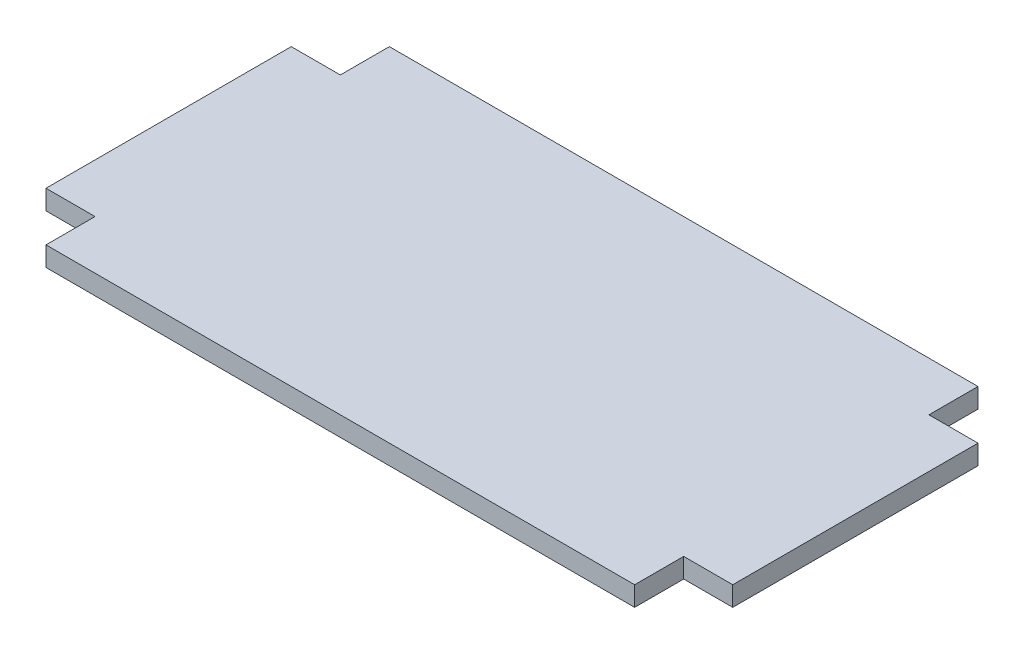
ISO-10303-21;
HEADER;
FILE_DESCRIPTION(('STEP AP214'),'2;1');
FILE_NAME('part.step','',(''),(''),'','','');
FILE_SCHEMA(('AUTOMOTIVE_DESIGN { 1 0 10303 214 1 1 1 1 }'));
ENDSEC;
DATA;
#1=APPLICATION_CONTEXT('core data for automotive mechanical design processes');
#2=APPLICATION_PROTOCOL_DEFINITION('international standard','automotive_design',2000,#1);
#3=PRODUCT_CONTEXT('',#1,'mechanical');
#4=PRODUCT('Part','Part','',(#3));
#5=PRODUCT_RELATED_PRODUCT_CATEGORY('part','',(#4));
#6=PRODUCT_DEFINITION_FORMATION('','',#4);
#7=PRODUCT_DEFINITION_CONTEXT('part definition',#1,'design');
#8=PRODUCT_DEFINITION('design','',#6,#7);
#9=PRODUCT_DEFINITION_SHAPE('','',#8);
#10=(LENGTH_UNIT() NAMED_UNIT(*) SI_UNIT(.MILLI.,.METRE.));
#11=(NAMED_UNIT(*) PLANE_ANGLE_UNIT() SI_UNIT($,.RADIAN.));
#12=(NAMED_UNIT(*) SI_UNIT($,.STERADIAN.) SOLID_ANGLE_UNIT());
#13=UNCERTAINTY_MEASURE_WITH_UNIT(LENGTH_MEASURE(1.E-05),#10,'distance_accuracy_value','');
#14=(GEOMETRIC_REPRESENTATION_CONTEXT(3) GLOBAL_UNCERTAINTY_ASSIGNED_CONTEXT((#13)) GLOBAL_UNIT_ASSIGNED_CONTEXT((#10,
#11,#12)) REPRESENTATION_CONTEXT('',''));
#15=CARTESIAN_POINT('',(0.,0.,0.));
#16=DIRECTION('',(0.,0.,1.));
#17=DIRECTION('',(1.,0.,0.));
#18=AXIS2_PLACEMENT_3D('',#15,#16,#17);
#19=CARTESIAN_POINT('',(60.,4.,35.));
#20=DIRECTION('',(-1.,0.,0.));
#21=DIRECTION('',(0.,0.,1.));
#22=AXIS2_PLACEMENT_3D('',#19,#20,#21);
#23=PLANE('',#22);
#24=DIRECTION('',(0.,0.,-1.));
#25=VECTOR('',#24,1.);
#26=CARTESIAN_POINT('',(60.,0.,35.));
#27=LINE('',#26,#25);
#28=CARTESIAN_POINT('',(60.,0.,35.));
#29=VERTEX_POINT('',#28);
#30=CARTESIAN_POINT('',(60.,0.,25.));
#31=VERTEX_POINT('',#30);
#32=EDGE_CURVE('E170',#29,#31,#27,.T.);
#33=ORIENTED_EDGE('',*,*,#32,.T.);
#34=DIRECTION('',(0.,-1.,0.));
#35=VECTOR('',#34,1.);
#36=CARTESIAN_POINT('',(60.,4.,25.));
#37=LINE('',#36,#35);
#38=CARTESIAN_POINT('',(60.,4.,25.));
#39=VERTEX_POINT('',#38);
#40=EDGE_CURVE('E11',#39,#31,#37,.T.);
#41=ORIENTED_EDGE('',*,*,#40,.F.);
#42=DIRECTION('',(0.,0.,-1.));
#43=VECTOR('',#42,1.);
#44=CARTESIAN_POINT('',(60.,4.,35.));
#45=LINE('',#44,#43);
#46=CARTESIAN_POINT('',(60.,4.,35.));
#47=VERTEX_POINT('',#46);
#48=EDGE_CURVE('E204',#47,#39,#45,.T.);
#49=ORIENTED_EDGE('',*,*,#48,.F.);
#50=DIRECTION('',(0.,-1.,0.));
#51=VECTOR('',#50,1.);
#52=CARTESIAN_POINT('',(60.,4.,35.));
#53=LINE('',#52,#51);
#54=EDGE_CURVE('E166',#47,#29,#53,.T.);
#55=ORIENTED_EDGE('',*,*,#54,.T.);
#56=EDGE_LOOP('',(#33,#41,#49,#55));
#57=FACE_BOUND('',#56,.T.);
#58=ADVANCED_FACE('F45',(#57),#23,.F.);
#59=CARTESIAN_POINT('',(70.,4.,25.));
#60=DIRECTION('',(0.,0.,-1.));
#61=DIRECTION('',(-1.,0.,0.));
#62=AXIS2_PLACEMENT_3D('',#59,#60,#61);
#63=PLANE('',#62);
#64=DIRECTION('',(1.,0.,0.));
#65=VECTOR('',#64,1.);
#66=CARTESIAN_POINT('',(70.,0.,25.));
#67=LINE('',#66,#65);
#68=CARTESIAN_POINT('',(70.,0.,25.));
#69=VERTEX_POINT('',#68);
#70=EDGE_CURVE('E174',#31,#69,#67,.T.);
#71=ORIENTED_EDGE('',*,*,#70,.T.);
#72=DIRECTION('',(0.,-1.,0.));
#73=VECTOR('',#72,1.);
#74=CARTESIAN_POINT('',(70.,4.,25.));
#75=LINE('',#74,#73);
#76=CARTESIAN_POINT('',(70.,4.,25.));
#77=VERTEX_POINT('',#76);
#78=EDGE_CURVE('E54',#77,#69,#75,.T.);
#79=ORIENTED_EDGE('',*,*,#78,.F.);
#80=DIRECTION('',(1.,0.,0.));
#81=VECTOR('',#80,1.);
#82=CARTESIAN_POINT('',(70.,4.,25.));
#83=LINE('',#82,#81);
#84=EDGE_CURVE('E117',#39,#77,#83,.T.);
#85=ORIENTED_EDGE('',*,*,#84,.F.);
#86=ORIENTED_EDGE('',*,*,#40,.T.);
#87=EDGE_LOOP('',(#71,#79,#85,#86));
#88=FACE_BOUND('',#87,.T.);
#89=ADVANCED_FACE('F298',(#88),#63,.F.);
#90=CARTESIAN_POINT('',(70.,4.,25.));
#91=DIRECTION('',(-1.,0.,0.));
#92=DIRECTION('',(0.,0.,1.));
#93=AXIS2_PLACEMENT_3D('',#90,#91,#92);
#94=PLANE('',#93);
#95=DIRECTION('',(0.,0.,-1.));
#96=VECTOR('',#95,1.);
#97=CARTESIAN_POINT('',(70.,0.,25.));
#98=LINE('',#97,#96);
#99=CARTESIAN_POINT('',(70.,0.,-25.));
#100=VERTEX_POINT('',#99);
#101=EDGE_CURVE('E177',#69,#100,#98,.T.);
#102=ORIENTED_EDGE('',*,*,#101,.T.);
#103=DIRECTION('',(0.,-1.,0.));
#104=VECTOR('',#103,1.);
#105=CARTESIAN_POINT('',(70.,4.,-25.));
#106=LINE('',#105,#104);
#107=CARTESIAN_POINT('',(70.,4.,-25.));
#108=VERTEX_POINT('',#107);
#109=EDGE_CURVE('E231',#108,#100,#106,.T.);
#110=ORIENTED_EDGE('',*,*,#109,.F.);
#111=DIRECTION('',(0.,0.,-1.));
#112=VECTOR('',#111,1.);
#113=CARTESIAN_POINT('',(70.,4.,25.));
#114=LINE('',#113,#112);
#115=EDGE_CURVE('E241',#77,#108,#114,.T.);
#116=ORIENTED_EDGE('',*,*,#115,.F.);
#117=ORIENTED_EDGE('',*,*,#78,.T.);
#118=EDGE_LOOP('',(#102,#110,#116,#117));
#119=FACE_BOUND('',#118,.T.);
#120=ADVANCED_FACE('F239',(#119),#94,.F.);
#121=CARTESIAN_POINT('',(70.,4.,-25.));
#122=DIRECTION('',(0.,0.,1.));
#123=DIRECTION('',(1.,0.,0.));
#124=AXIS2_PLACEMENT_3D('',#121,#122,#123);
#125=PLANE('',#124);
#126=DIRECTION('',(-1.,0.,0.));
#127=VECTOR('',#126,1.);
#128=CARTESIAN_POINT('',(70.,0.,-25.));
#129=LINE('',#128,#127);
#130=CARTESIAN_POINT('',(60.,0.,-25.));
#131=VERTEX_POINT('',#130);
#132=EDGE_CURVE('E180',#100,#131,#129,.T.);
#133=ORIENTED_EDGE('',*,*,#132,.T.);
#134=DIRECTION('',(0.,-1.,0.));
#135=VECTOR('',#134,1.);
#136=CARTESIAN_POINT('',(60.,4.,-25.));
#137=LINE('',#136,#135);
#138=CARTESIAN_POINT('',(60.,4.,-25.));
#139=VERTEX_POINT('',#138);
#140=EDGE_CURVE('E227',#139,#131,#137,.T.);
#141=ORIENTED_EDGE('',*,*,#140,.F.);
#142=DIRECTION('',(-1.,0.,0.));
#143=VECTOR('',#142,1.);
#144=CARTESIAN_POINT('',(70.,4.,-25.));
#145=LINE('',#144,#143);
#146=EDGE_CURVE('E260',#108,#139,#145,.T.);
#147=ORIENTED_EDGE('',*,*,#146,.F.);
#148=ORIENTED_EDGE('',*,*,#109,.T.);
#149=EDGE_LOOP('',(#133,#141,#147,#148));
#150=FACE_BOUND('',#149,.T.);
#151=ADVANCED_FACE('F250',(#150),#125,.F.);
#152=CARTESIAN_POINT('',(60.,4.,-35.));
#153=DIRECTION('',(-1.,0.,0.));
#154=DIRECTION('',(0.,0.,1.));
#155=AXIS2_PLACEMENT_3D('',#152,#153,#154);
#156=PLANE('',#155);
#157=DIRECTION('',(0.,0.,-1.));
#158=VECTOR('',#157,1.);
#159=CARTESIAN_POINT('',(60.,0.,-35.));
#160=LINE('',#159,#158);
#161=CARTESIAN_POINT('',(60.,0.,-35.));
#162=VERTEX_POINT('',#161);
#163=EDGE_CURVE('E183',#131,#162,#160,.T.);
#164=ORIENTED_EDGE('',*,*,#163,.T.);
#165=DIRECTION('',(0.,-1.,0.));
#166=VECTOR('',#165,1.);
#167=CARTESIAN_POINT('',(60.,4.,-35.));
#168=LINE('',#167,#166);
#169=CARTESIAN_POINT('',(60.,4.,-35.));
#170=VERTEX_POINT('',#169);
#171=EDGE_CURVE('E223',#170,#162,#168,.T.);
#172=ORIENTED_EDGE('',*,*,#171,.F.);
#173=DIRECTION('',(0.,0.,-1.));
#174=VECTOR('',#173,1.);
#175=CARTESIAN_POINT('',(60.,4.,-35.));
#176=LINE('',#175,#174);
#177=EDGE_CURVE('E256',#139,#170,#176,.T.);
#178=ORIENTED_EDGE('',*,*,#177,.F.);
#179=ORIENTED_EDGE('',*,*,#140,.T.);
#180=EDGE_LOOP('',(#164,#172,#178,#179));
#181=FACE_BOUND('',#180,.T.);
#182=ADVANCED_FACE('F254',(#181),#156,.F.);
#183=CARTESIAN_POINT('',(-60.,4.,-35.));
#184=DIRECTION('',(0.,0.,1.));
#185=DIRECTION('',(1.,0.,0.));
#186=AXIS2_PLACEMENT_3D('',#183,#184,#185);
#187=PLANE('',#186);
#188=DIRECTION('',(-1.,0.,0.));
#189=VECTOR('',#188,1.);
#190=CARTESIAN_POINT('',(-60.,0.,-35.));
#191=LINE('',#190,#189);
#192=CARTESIAN_POINT('',(-60.,0.,-35.));
#193=VERTEX_POINT('',#192);
#194=EDGE_CURVE('E186',#162,#193,#191,.T.);
#195=ORIENTED_EDGE('',*,*,#194,.T.);
#196=DIRECTION('',(0.,-1.,0.));
#197=VECTOR('',#196,1.);
#198=CARTESIAN_POINT('',(-60.,4.,-35.));
#199=LINE('',#198,#197);
#200=CARTESIAN_POINT('',(-60.,4.,-35.));
#201=VERTEX_POINT('',#200);
#202=EDGE_CURVE('E219',#201,#193,#199,.T.);
#203=ORIENTED_EDGE('',*,*,#202,.F.);
#204=DIRECTION('',(-1.,0.,0.));
#205=VECTOR('',#204,1.);
#206=CARTESIAN_POINT('',(-60.,4.,-35.));
#207=LINE('',#206,#205);
#208=EDGE_CURVE('E259',#170,#201,#207,.T.);
#209=ORIENTED_EDGE('',*,*,#208,.F.);
#210=ORIENTED_EDGE('',*,*,#171,.T.);
#211=EDGE_LOOP('',(#195,#203,#209,#210));
#212=FACE_BOUND('',#211,.T.);
#213=ADVANCED_FACE('F311',(#212),#187,.F.);
#214=CARTESIAN_POINT('',(-60.,4.,-35.));
#215=DIRECTION('',(1.,0.,0.));
#216=DIRECTION('',(0.,0.,-1.));
#217=AXIS2_PLACEMENT_3D('',#214,#215,#216);
#218=PLANE('',#217);
#219=DIRECTION('',(0.,0.,1.));
#220=VECTOR('',#219,1.);
#221=CARTESIAN_POINT('',(-60.,0.,-35.));
#222=LINE('',#221,#220);
#223=CARTESIAN_POINT('',(-60.,0.,-25.));
#224=VERTEX_POINT('',#223);
#225=EDGE_CURVE('E189',#193,#224,#222,.T.);
#226=ORIENTED_EDGE('',*,*,#225,.T.);
#227=DIRECTION('',(0.,-1.,0.));
#228=VECTOR('',#227,1.);
#229=CARTESIAN_POINT('',(-60.,4.,-25.));
#230=LINE('',#229,#228);
#231=CARTESIAN_POINT('',(-60.,4.,-25.));
#232=VERTEX_POINT('',#231);
#233=EDGE_CURVE('E215',#232,#224,#230,.T.);
#234=ORIENTED_EDGE('',*,*,#233,.F.);
#235=DIRECTION('',(0.,0.,1.));
#236=VECTOR('',#235,1.);
#237=CARTESIAN_POINT('',(-60.,4.,-35.));
#238=LINE('',#237,#236);
#239=EDGE_CURVE('E264',#201,#232,#238,.T.);
#240=ORIENTED_EDGE('',*,*,#239,.F.);
#241=ORIENTED_EDGE('',*,*,#202,.T.);
#242=EDGE_LOOP('',(#226,#234,#240,#241));
#243=FACE_BOUND('',#242,.T.);
#244=ADVANCED_FACE('F314',(#243),#218,.F.);
#245=CARTESIAN_POINT('',(-70.,4.,-25.));
#246=DIRECTION('',(0.,0.,1.));
#247=DIRECTION('',(1.,0.,0.));
#248=AXIS2_PLACEMENT_3D('',#245,#246,#247);
#249=PLANE('',#248);
#250=DIRECTION('',(-1.,0.,0.));
#251=VECTOR('',#250,1.);
#252=CARTESIAN_POINT('',(-70.,0.,-25.));
#253=LINE('',#252,#251);
#254=CARTESIAN_POINT('',(-70.,0.,-25.));
#255=VERTEX_POINT('',#254);
#256=EDGE_CURVE('E192',#224,#255,#253,.T.);
#257=ORIENTED_EDGE('',*,*,#256,.T.);
#258=DIRECTION('',(0.,-1.,0.));
#259=VECTOR('',#258,1.);
#260=CARTESIAN_POINT('',(-70.,4.,-25.));
#261=LINE('',#260,#259);
#262=CARTESIAN_POINT('',(-70.,4.,-25.));
#263=VERTEX_POINT('',#262);
#264=EDGE_CURVE('E211',#263,#255,#261,.T.);
#265=ORIENTED_EDGE('',*,*,#264,.F.);
#266=DIRECTION('',(-1.,0.,0.));
#267=VECTOR('',#266,1.);
#268=CARTESIAN_POINT('',(-70.,4.,-25.));
#269=LINE('',#268,#267);
#270=EDGE_CURVE('E271',#232,#263,#269,.T.);
#271=ORIENTED_EDGE('',*,*,#270,.F.);
#272=ORIENTED_EDGE('',*,*,#233,.T.);
#273=EDGE_LOOP('',(#257,#265,#271,#272));
#274=FACE_BOUND('',#273,.T.);
#275=ADVANCED_FACE('F279',(#274),#249,.F.);
#276=CARTESIAN_POINT('',(-70.,4.,25.));
#277=DIRECTION('',(1.,0.,0.));
#278=DIRECTION('',(0.,0.,-1.));
#279=AXIS2_PLACEMENT_3D('',#276,#277,#278);
#280=PLANE('',#279);
#281=DIRECTION('',(0.,0.,1.));
#282=VECTOR('',#281,1.);
#283=CARTESIAN_POINT('',(-70.,0.,25.));
#284=LINE('',#283,#282);
#285=CARTESIAN_POINT('',(-70.,0.,25.));
#286=VERTEX_POINT('',#285);
#287=EDGE_CURVE('E195',#255,#286,#284,.T.);
#288=ORIENTED_EDGE('',*,*,#287,.T.);
#289=DIRECTION('',(0.,-1.,0.));
#290=VECTOR('',#289,1.);
#291=CARTESIAN_POINT('',(-70.,4.,25.));
#292=LINE('',#291,#290);
#293=CARTESIAN_POINT('',(-70.,4.,25.));
#294=VERTEX_POINT('',#293);
#295=EDGE_CURVE('E159',#294,#286,#292,.T.);
#296=ORIENTED_EDGE('',*,*,#295,.F.);
#297=DIRECTION('',(0.,0.,1.));
#298=VECTOR('',#297,1.);
#299=CARTESIAN_POINT('',(-70.,4.,25.));
#300=LINE('',#299,#298);
#301=EDGE_CURVE('E148',#263,#294,#300,.T.);
#302=ORIENTED_EDGE('',*,*,#301,.F.);
#303=ORIENTED_EDGE('',*,*,#264,.T.);
#304=EDGE_LOOP('',(#288,#296,#302,#303));
#305=FACE_BOUND('',#304,.T.);
#306=ADVANCED_FACE('F283',(#305),#280,.F.);
#307=CARTESIAN_POINT('',(-70.,4.,25.));
#308=DIRECTION('',(0.,0.,-1.));
#309=DIRECTION('',(-1.,0.,0.));
#310=AXIS2_PLACEMENT_3D('',#307,#308,#309);
#311=PLANE('',#310);
#312=DIRECTION('',(1.,0.,0.));
#313=VECTOR('',#312,1.);
#314=CARTESIAN_POINT('',(-70.,0.,25.));
#315=LINE('',#314,#313);
#316=CARTESIAN_POINT('',(-60.,0.,25.));
#317=VERTEX_POINT('',#316);
#318=EDGE_CURVE('E157',#286,#317,#315,.T.);
#319=ORIENTED_EDGE('',*,*,#318,.T.);
#320=DIRECTION('',(0.,-1.,0.));
#321=VECTOR('',#320,1.);
#322=CARTESIAN_POINT('',(-60.,4.,25.));
#323=LINE('',#322,#321);
#324=CARTESIAN_POINT('',(-60.,4.,25.));
#325=VERTEX_POINT('',#324);
#326=EDGE_CURVE('E154',#325,#317,#323,.T.);
#327=ORIENTED_EDGE('',*,*,#326,.F.);
#328=DIRECTION('',(1.,0.,0.));
#329=VECTOR('',#328,1.);
#330=CARTESIAN_POINT('',(-70.,4.,25.));
#331=LINE('',#330,#329);
#332=EDGE_CURVE('E142',#294,#325,#331,.T.);
#333=ORIENTED_EDGE('',*,*,#332,.F.);
#334=ORIENTED_EDGE('',*,*,#295,.T.);
#335=EDGE_LOOP('',(#319,#327,#333,#334));
#336=FACE_BOUND('',#335,.T.);
#337=ADVANCED_FACE('F155',(#336),#311,.F.);
#338=CARTESIAN_POINT('',(-60.,4.,35.));
#339=DIRECTION('',(1.,0.,0.));
#340=DIRECTION('',(0.,0.,-1.));
#341=AXIS2_PLACEMENT_3D('',#338,#339,#340);
#342=PLANE('',#341);
#343=DIRECTION('',(0.,0.,1.));
#344=VECTOR('',#343,1.);
#345=CARTESIAN_POINT('',(-60.,0.,35.));
#346=LINE('',#345,#344);
#347=CARTESIAN_POINT('',(-60.,0.,35.));
#348=VERTEX_POINT('',#347);
#349=EDGE_CURVE('E103',#317,#348,#346,.T.);
#350=ORIENTED_EDGE('',*,*,#349,.T.);
#351=DIRECTION('',(0.,-1.,0.));
#352=VECTOR('',#351,1.);
#353=CARTESIAN_POINT('',(-60.,4.,35.));
#354=LINE('',#353,#352);
#355=CARTESIAN_POINT('',(-60.,4.,35.));
#356=VERTEX_POINT('',#355);
#357=EDGE_CURVE('E160',#356,#348,#354,.T.);
#358=ORIENTED_EDGE('',*,*,#357,.F.);
#359=DIRECTION('',(0.,0.,1.));
#360=VECTOR('',#359,1.);
#361=CARTESIAN_POINT('',(-60.,4.,35.));
#362=LINE('',#361,#360);
#363=EDGE_CURVE('E146',#325,#356,#362,.T.);
#364=ORIENTED_EDGE('',*,*,#363,.F.);
#365=ORIENTED_EDGE('',*,*,#326,.T.);
#366=EDGE_LOOP('',(#350,#358,#364,#365));
#367=FACE_BOUND('',#366,.T.);
#368=ADVANCED_FACE('F162',(#367),#342,.F.);
#369=CARTESIAN_POINT('',(-60.,4.,35.));
#370=DIRECTION('',(0.,0.,-1.));
#371=DIRECTION('',(-1.,0.,0.));
#372=AXIS2_PLACEMENT_3D('',#369,#370,#371);
#373=PLANE('',#372);
#374=DIRECTION('',(1.,0.,0.));
#375=VECTOR('',#374,1.);
#376=CARTESIAN_POINT('',(-60.,0.,35.));
#377=LINE('',#376,#375);
#378=EDGE_CURVE('E109',#348,#29,#377,.T.);
#379=ORIENTED_EDGE('',*,*,#378,.T.);
#380=ORIENTED_EDGE('',*,*,#54,.F.);
#381=DIRECTION('',(1.,0.,0.));
#382=VECTOR('',#381,1.);
#383=CARTESIAN_POINT('',(-60.,4.,35.));
#384=LINE('',#383,#382);
#385=EDGE_CURVE('E62',#356,#47,#384,.T.);
#386=ORIENTED_EDGE('',*,*,#385,.F.);
#387=ORIENTED_EDGE('',*,*,#357,.T.);
#388=EDGE_LOOP('',(#379,#380,#386,#387));
#389=FACE_BOUND('',#388,.T.);
#390=ADVANCED_FACE('F287',(#389),#373,.F.);
#391=CARTESIAN_POINT('',(0.,4.,0.));
#392=DIRECTION('',(0.,1.,0.));
#393=DIRECTION('',(0.,0.,1.));
#394=AXIS2_PLACEMENT_3D('',#391,#392,#393);
#395=PLANE('',#394);
#396=ORIENTED_EDGE('',*,*,#48,.T.);
#397=ORIENTED_EDGE('',*,*,#84,.T.);
#398=ORIENTED_EDGE('',*,*,#115,.T.);
#399=ORIENTED_EDGE('',*,*,#146,.T.);
#400=ORIENTED_EDGE('',*,*,#177,.T.);
#401=ORIENTED_EDGE('',*,*,#208,.T.);
#402=ORIENTED_EDGE('',*,*,#239,.T.);
#403=ORIENTED_EDGE('',*,*,#270,.T.);
#404=ORIENTED_EDGE('',*,*,#301,.T.);
#405=ORIENTED_EDGE('',*,*,#332,.T.);
#406=ORIENTED_EDGE('',*,*,#363,.T.);
#407=ORIENTED_EDGE('',*,*,#385,.T.);
#408=EDGE_LOOP('',(#396,#397,#398,#399,#400,#401,#402,#403,#404,#405,#406,#407));
#409=FACE_BOUND('',#408,.T.);
#410=ADVANCED_FACE('F144',(#409),#395,.T.);
#411=CARTESIAN_POINT('',(0.,0.,0.));
#412=DIRECTION('',(0.,1.,0.));
#413=DIRECTION('',(0.,0.,1.));
#414=AXIS2_PLACEMENT_3D('',#411,#412,#413);
#415=PLANE('',#414);
#416=ORIENTED_EDGE('',*,*,#32,.F.);
#417=ORIENTED_EDGE('',*,*,#378,.F.);
#418=ORIENTED_EDGE('',*,*,#349,.F.);
#419=ORIENTED_EDGE('',*,*,#318,.F.);
#420=ORIENTED_EDGE('',*,*,#287,.F.);
#421=ORIENTED_EDGE('',*,*,#256,.F.);
#422=ORIENTED_EDGE('',*,*,#225,.F.);
#423=ORIENTED_EDGE('',*,*,#194,.F.);
#424=ORIENTED_EDGE('',*,*,#163,.F.);
#425=ORIENTED_EDGE('',*,*,#132,.F.);
#426=ORIENTED_EDGE('',*,*,#101,.F.);
#427=ORIENTED_EDGE('',*,*,#70,.F.);
#428=EDGE_LOOP('',(#416,#417,#418,#419,#420,#421,#422,#423,#424,#425,#426,#427));
#429=FACE_BOUND('',#428,.T.);
#430=ADVANCED_FACE('F245',(#429),#415,.F.);
#431=CLOSED_SHELL('',(#58,#89,#120,#151,#182,#213,#244,#275,#306,#337,#368,#390,#410,#430));
#432=MANIFOLD_SOLID_BREP('B2',#431);
#433=ADVANCED_BREP_SHAPE_REPRESENTATION('',(#18,#432),#14);
#434=SHAPE_DEFINITION_REPRESENTATION(#9,#433);
ENDSEC;
END-ISO-10303-21;
